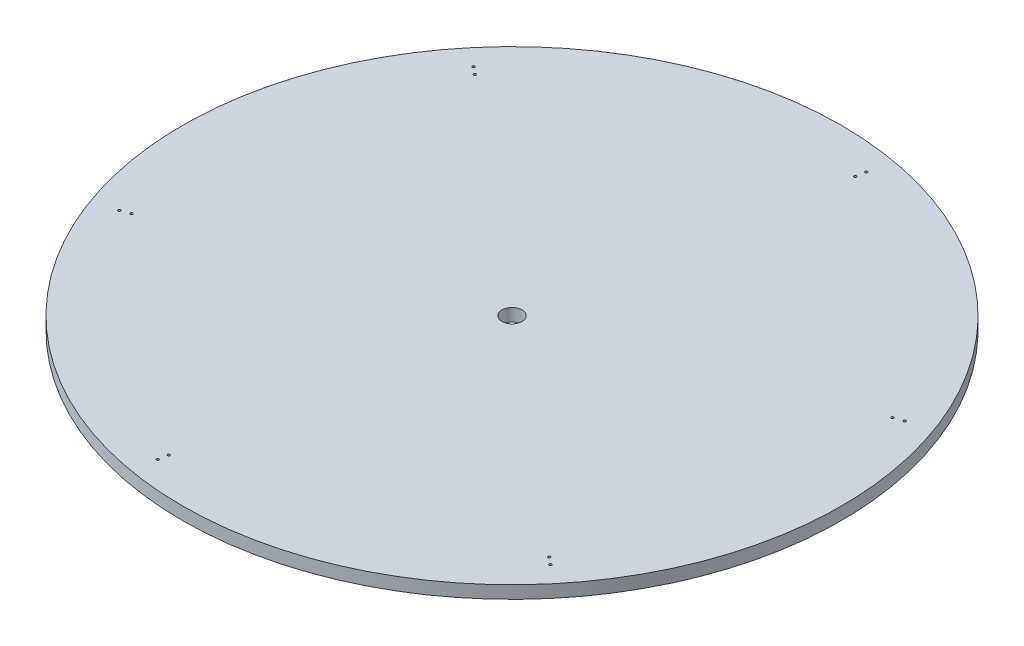
ISO-10303-21;
HEADER;
FILE_DESCRIPTION(('STEP AP214'),'2;1');
FILE_NAME('part.step','',(''),(''),'','','');
FILE_SCHEMA(('AUTOMOTIVE_DESIGN { 1 0 10303 214 1 1 1 1 }'));
ENDSEC;
DATA;
#1=APPLICATION_CONTEXT('core data for automotive mechanical design processes');
#2=APPLICATION_PROTOCOL_DEFINITION('international standard','automotive_design',2000,#1);
#3=PRODUCT_CONTEXT('',#1,'mechanical');
#4=PRODUCT('Part','Part','',(#3));
#5=PRODUCT_RELATED_PRODUCT_CATEGORY('part','',(#4));
#6=PRODUCT_DEFINITION_FORMATION('','',#4);
#7=PRODUCT_DEFINITION_CONTEXT('part definition',#1,'design');
#8=PRODUCT_DEFINITION('design','',#6,#7);
#9=PRODUCT_DEFINITION_SHAPE('','',#8);
#10=(LENGTH_UNIT() NAMED_UNIT(*) SI_UNIT(.MILLI.,.METRE.));
#11=(NAMED_UNIT(*) PLANE_ANGLE_UNIT() SI_UNIT($,.RADIAN.));
#12=(NAMED_UNIT(*) SI_UNIT($,.STERADIAN.) SOLID_ANGLE_UNIT());
#13=UNCERTAINTY_MEASURE_WITH_UNIT(LENGTH_MEASURE(1.E-05),#10,'distance_accuracy_value','');
#14=(GEOMETRIC_REPRESENTATION_CONTEXT(3) GLOBAL_UNCERTAINTY_ASSIGNED_CONTEXT((#13)) GLOBAL_UNIT_ASSIGNED_CONTEXT((#10,
#11,#12)) REPRESENTATION_CONTEXT('',''));
#15=CARTESIAN_POINT('',(0.,0.,0.));
#16=DIRECTION('',(0.,0.,1.));
#17=DIRECTION('',(1.,0.,0.));
#18=AXIS2_PLACEMENT_3D('',#15,#16,#17);
#19=CARTESIAN_POINT('',(0.,20.,0.));
#20=DIRECTION('',(0.,-1.,0.));
#21=DIRECTION('',(0.,0.,-1.));
#22=AXIS2_PLACEMENT_3D('',#19,#20,#21);
#23=CYLINDRICAL_SURFACE('',#22,520.);
#24=CARTESIAN_POINT('',(0.,20.,0.));
#25=DIRECTION('',(0.,1.,0.));
#26=DIRECTION('',(0.,0.,1.));
#27=AXIS2_PLACEMENT_3D('',#24,#25,#26);
#28=CIRCLE('',#27,520.);
#29=CARTESIAN_POINT('',(0.,20.,520.));
#30=VERTEX_POINT('',#29);
#31=EDGE_CURVE('E10',#30,#30,#28,.T.);
#32=ORIENTED_EDGE('',*,*,#31,.F.);
#33=EDGE_LOOP('',(#32));
#34=FACE_BOUND('',#33,.T.);
#35=CARTESIAN_POINT('',(0.,0.,0.));
#36=DIRECTION('',(0.,1.,0.));
#37=DIRECTION('',(0.,0.,1.));
#38=AXIS2_PLACEMENT_3D('',#35,#36,#37);
#39=CIRCLE('',#38,520.);
#40=CARTESIAN_POINT('',(0.,0.,520.));
#41=VERTEX_POINT('',#40);
#42=EDGE_CURVE('E38',#41,#41,#39,.T.);
#43=ORIENTED_EDGE('',*,*,#42,.T.);
#44=EDGE_LOOP('',(#43));
#45=FACE_BOUND('',#44,.T.);
#46=ADVANCED_FACE('F31',(#34,#45),#23,.T.);
#47=CARTESIAN_POINT('',(0.,20.,0.));
#48=DIRECTION('',(0.,1.,0.));
#49=DIRECTION('',(0.,0.,1.));
#50=AXIS2_PLACEMENT_3D('',#47,#48,#49);
#51=PLANE('',#50);
#52=CARTESIAN_POINT('',(-83.1513001658663,20.,475.788671620787));
#53=DIRECTION('',(0.,1.,0.));
#54=DIRECTION('',(0.,0.,1.));
#55=AXIS2_PLACEMENT_3D('',#52,#53,#54);
#56=CIRCLE('',#55,2.);
#57=CARTESIAN_POINT('',(-83.1513001658663,20.,477.788671620787));
#58=VERTEX_POINT('',#57);
#59=EDGE_CURVE('E93',#58,#58,#56,.F.);
#60=ORIENTED_EDGE('',*,*,#59,.T.);
#61=EDGE_LOOP('',(#60));
#62=FACE_BOUND('',#61,.T.);
#63=CARTESIAN_POINT('',(-80.5629493191627,20.,461.013677884939));
#64=DIRECTION('',(0.,1.,0.));
#65=DIRECTION('',(0.,0.,1.));
#66=AXIS2_PLACEMENT_3D('',#63,#64,#65);
#67=CIRCLE('',#66,2.00709120209909);
#68=CARTESIAN_POINT('',(-80.5629493191627,20.,463.020769087038));
#69=VERTEX_POINT('',#68);
#70=EDGE_CURVE('E90',#69,#69,#67,.F.);
#71=ORIENTED_EDGE('',*,*,#70,.T.);
#72=EDGE_LOOP('',(#71));
#73=FACE_BOUND('',#72,.T.);
#74=CARTESIAN_POINT('',(370.469426373522,20.,309.905474111738));
#75=DIRECTION('',(0.,1.,0.));
#76=DIRECTION('',(0.,0.,1.));
#77=AXIS2_PLACEMENT_3D('',#74,#75,#76);
#78=CIRCLE('',#77,2.);
#79=CARTESIAN_POINT('',(370.469426373522,20.,311.905474111738));
#80=VERTEX_POINT('',#79);
#81=EDGE_CURVE('E87',#80,#80,#78,.F.);
#82=ORIENTED_EDGE('',*,*,#81,.T.);
#83=EDGE_LOOP('',(#82));
#84=FACE_BOUND('',#83,.T.);
#85=CARTESIAN_POINT('',(358.968081880873,20.,300.276399656662));
#86=DIRECTION('',(0.,1.,0.));
#87=DIRECTION('',(0.,0.,1.));
#88=AXIS2_PLACEMENT_3D('',#85,#86,#87);
#89=CIRCLE('',#88,2.00709120209909);
#90=CARTESIAN_POINT('',(358.968081880873,20.,302.283490858761));
#91=VERTEX_POINT('',#90);
#92=EDGE_CURVE('E83',#91,#91,#89,.F.);
#93=ORIENTED_EDGE('',*,*,#92,.T.);
#94=EDGE_LOOP('',(#93));
#95=FACE_BOUND('',#94,.T.);
#96=CARTESIAN_POINT('',(453.620726539385,20.,-165.883197509054));
#97=DIRECTION('',(0.,1.,0.));
#98=DIRECTION('',(0.,0.,1.));
#99=AXIS2_PLACEMENT_3D('',#96,#97,#98);
#100=CIRCLE('',#99,2.);
#101=CARTESIAN_POINT('',(453.620726539385,20.,-163.883197509054));
#102=VERTEX_POINT('',#101);
#103=EDGE_CURVE('E79',#102,#102,#100,.F.);
#104=ORIENTED_EDGE('',*,*,#103,.T.);
#105=EDGE_LOOP('',(#104));
#106=FACE_BOUND('',#105,.T.);
#107=CARTESIAN_POINT('',(439.531031200033,20.,-160.737278228281));
#108=DIRECTION('',(0.,1.,0.));
#109=DIRECTION('',(0.,0.,1.));
#110=AXIS2_PLACEMENT_3D('',#107,#108,#109);
#111=CIRCLE('',#110,2.00709120209909);
#112=CARTESIAN_POINT('',(439.531031200033,20.,-158.730187026182));
#113=VERTEX_POINT('',#112);
#114=EDGE_CURVE('E75',#113,#113,#111,.F.);
#115=ORIENTED_EDGE('',*,*,#114,.T.);
#116=EDGE_LOOP('',(#115));
#117=FACE_BOUND('',#116,.T.);
#118=CARTESIAN_POINT('',(83.1513001658629,20.,-475.788671620788));
#119=DIRECTION('',(0.,1.,0.));
#120=DIRECTION('',(0.,0.,1.));
#121=AXIS2_PLACEMENT_3D('',#118,#119,#120);
#122=CIRCLE('',#121,2.);
#123=CARTESIAN_POINT('',(83.1513001658629,20.,-473.788671620788));
#124=VERTEX_POINT('',#123);
#125=EDGE_CURVE('E71',#124,#124,#122,.F.);
#126=ORIENTED_EDGE('',*,*,#125,.T.);
#127=EDGE_LOOP('',(#126));
#128=FACE_BOUND('',#127,.T.);
#129=CARTESIAN_POINT('',(80.5629493191595,20.,-461.013677884939));
#130=DIRECTION('',(0.,1.,0.));
#131=DIRECTION('',(0.,0.,1.));
#132=AXIS2_PLACEMENT_3D('',#129,#130,#131);
#133=CIRCLE('',#132,2.00709120209909);
#134=CARTESIAN_POINT('',(80.5629493191595,20.,-459.00658668284));
#135=VERTEX_POINT('',#134);
#136=EDGE_CURVE('E67',#135,#135,#133,.F.);
#137=ORIENTED_EDGE('',*,*,#136,.T.);
#138=EDGE_LOOP('',(#137));
#139=FACE_BOUND('',#138,.T.);
#140=CARTESIAN_POINT('',(-370.469426373524,20.,-309.905474111736));
#141=DIRECTION('',(0.,1.,0.));
#142=DIRECTION('',(0.,0.,1.));
#143=AXIS2_PLACEMENT_3D('',#140,#141,#142);
#144=CIRCLE('',#143,2.);
#145=CARTESIAN_POINT('',(-370.469426373524,20.,-307.905474111736));
#146=VERTEX_POINT('',#145);
#147=EDGE_CURVE('E63',#146,#146,#144,.F.);
#148=ORIENTED_EDGE('',*,*,#147,.T.);
#149=EDGE_LOOP('',(#148));
#150=FACE_BOUND('',#149,.T.);
#151=CARTESIAN_POINT('',(-358.968081880875,20.,-300.276399656659));
#152=DIRECTION('',(0.,1.,0.));
#153=DIRECTION('',(0.,0.,1.));
#154=AXIS2_PLACEMENT_3D('',#151,#152,#153);
#155=CIRCLE('',#154,2.00709120209909);
#156=CARTESIAN_POINT('',(-358.968081880875,20.,-298.26930845456));
#157=VERTEX_POINT('',#156);
#158=EDGE_CURVE('E59',#157,#157,#155,.F.);
#159=ORIENTED_EDGE('',*,*,#158,.T.);
#160=EDGE_LOOP('',(#159));
#161=FACE_BOUND('',#160,.T.);
#162=CARTESIAN_POINT('',(-453.620726539385,20.,165.883197509054));
#163=DIRECTION('',(0.,1.,0.));
#164=DIRECTION('',(0.,0.,1.));
#165=AXIS2_PLACEMENT_3D('',#162,#163,#164);
#166=CIRCLE('',#165,2.);
#167=CARTESIAN_POINT('',(-453.620726539385,20.,167.883197509054));
#168=VERTEX_POINT('',#167);
#169=EDGE_CURVE('E55',#168,#168,#166,.F.);
#170=ORIENTED_EDGE('',*,*,#169,.T.);
#171=EDGE_LOOP('',(#170));
#172=FACE_BOUND('',#171,.T.);
#173=CARTESIAN_POINT('',(-439.531031200033,20.,160.737278228281));
#174=DIRECTION('',(0.,1.,0.));
#175=DIRECTION('',(0.,0.,1.));
#176=AXIS2_PLACEMENT_3D('',#173,#174,#175);
#177=CIRCLE('',#176,2.00709120209909);
#178=CARTESIAN_POINT('',(-439.531031200033,20.,162.74436943038));
#179=VERTEX_POINT('',#178);
#180=EDGE_CURVE('E51',#179,#179,#177,.F.);
#181=ORIENTED_EDGE('',*,*,#180,.T.);
#182=EDGE_LOOP('',(#181));
#183=FACE_BOUND('',#182,.T.);
#184=CARTESIAN_POINT('',(0.,20.,0.));
#185=DIRECTION('',(0.,1.,0.));
#186=DIRECTION('',(0.,0.,1.));
#187=AXIS2_PLACEMENT_3D('',#184,#185,#186);
#188=CIRCLE('',#187,15.875);
#189=CARTESIAN_POINT('',(0.,20.,15.875));
#190=VERTEX_POINT('',#189);
#191=EDGE_CURVE('E43',#190,#190,#188,.F.);
#192=ORIENTED_EDGE('',*,*,#191,.T.);
#193=EDGE_LOOP('',(#192));
#194=FACE_BOUND('',#193,.T.);
#195=ORIENTED_EDGE('',*,*,#31,.T.);
#196=EDGE_LOOP('',(#195));
#197=FACE_BOUND('',#196,.T.);
#198=ADVANCED_FACE('F124',(#62,#73,#84,#95,#106,#117,#128,#139,#150,#161,#172,#183,#194,#197),
#51,.T.);
#199=CARTESIAN_POINT('',(0.,0.,0.));
#200=DIRECTION('',(0.,1.,0.));
#201=DIRECTION('',(0.,0.,1.));
#202=AXIS2_PLACEMENT_3D('',#199,#200,#201);
#203=PLANE('',#202);
#204=CARTESIAN_POINT('',(-83.1513001658663,0.,475.788671620787));
#205=DIRECTION('',(0.,1.,0.));
#206=DIRECTION('',(0.,0.,1.));
#207=AXIS2_PLACEMENT_3D('',#204,#205,#206);
#208=CIRCLE('',#207,2.);
#209=CARTESIAN_POINT('',(-83.1513001658663,0.,477.788671620787));
#210=VERTEX_POINT('',#209);
#211=EDGE_CURVE('E34',#210,#210,#208,.F.);
#212=ORIENTED_EDGE('',*,*,#211,.F.);
#213=EDGE_LOOP('',(#212));
#214=FACE_BOUND('',#213,.T.);
#215=CARTESIAN_POINT('',(-80.5629493191627,0.,461.013677884939));
#216=DIRECTION('',(0.,1.,0.));
#217=DIRECTION('',(0.,0.,1.));
#218=AXIS2_PLACEMENT_3D('',#215,#216,#217);
#219=CIRCLE('',#218,2.00709120209909);
#220=CARTESIAN_POINT('',(-80.5629493191627,0.,463.020769087038));
#221=VERTEX_POINT('',#220);
#222=EDGE_CURVE('E91',#221,#221,#219,.F.);
#223=ORIENTED_EDGE('',*,*,#222,.F.);
#224=EDGE_LOOP('',(#223));
#225=FACE_BOUND('',#224,.T.);
#226=CARTESIAN_POINT('',(370.469426373522,0.,309.905474111738));
#227=DIRECTION('',(0.,1.,0.));
#228=DIRECTION('',(0.,0.,1.));
#229=AXIS2_PLACEMENT_3D('',#226,#227,#228);
#230=CIRCLE('',#229,2.);
#231=CARTESIAN_POINT('',(370.469426373522,0.,311.905474111738));
#232=VERTEX_POINT('',#231);
#233=EDGE_CURVE('E88',#232,#232,#230,.F.);
#234=ORIENTED_EDGE('',*,*,#233,.F.);
#235=EDGE_LOOP('',(#234));
#236=FACE_BOUND('',#235,.T.);
#237=CARTESIAN_POINT('',(358.968081880873,0.,300.276399656662));
#238=DIRECTION('',(0.,1.,0.));
#239=DIRECTION('',(0.,0.,1.));
#240=AXIS2_PLACEMENT_3D('',#237,#238,#239);
#241=CIRCLE('',#240,2.00709120209909);
#242=CARTESIAN_POINT('',(358.968081880873,0.,302.283490858761));
#243=VERTEX_POINT('',#242);
#244=EDGE_CURVE('E84',#243,#243,#241,.F.);
#245=ORIENTED_EDGE('',*,*,#244,.F.);
#246=EDGE_LOOP('',(#245));
#247=FACE_BOUND('',#246,.T.);
#248=CARTESIAN_POINT('',(453.620726539385,0.,-165.883197509054));
#249=DIRECTION('',(0.,1.,0.));
#250=DIRECTION('',(0.,0.,1.));
#251=AXIS2_PLACEMENT_3D('',#248,#249,#250);
#252=CIRCLE('',#251,2.);
#253=CARTESIAN_POINT('',(453.620726539385,0.,-163.883197509054));
#254=VERTEX_POINT('',#253);
#255=EDGE_CURVE('E80',#254,#254,#252,.F.);
#256=ORIENTED_EDGE('',*,*,#255,.F.);
#257=EDGE_LOOP('',(#256));
#258=FACE_BOUND('',#257,.T.);
#259=CARTESIAN_POINT('',(439.531031200033,0.,-160.737278228281));
#260=DIRECTION('',(0.,1.,0.));
#261=DIRECTION('',(0.,0.,1.));
#262=AXIS2_PLACEMENT_3D('',#259,#260,#261);
#263=CIRCLE('',#262,2.00709120209909);
#264=CARTESIAN_POINT('',(439.531031200033,0.,-158.730187026182));
#265=VERTEX_POINT('',#264);
#266=EDGE_CURVE('E76',#265,#265,#263,.F.);
#267=ORIENTED_EDGE('',*,*,#266,.F.);
#268=EDGE_LOOP('',(#267));
#269=FACE_BOUND('',#268,.T.);
#270=CARTESIAN_POINT('',(83.1513001658629,0.,-475.788671620788));
#271=DIRECTION('',(0.,1.,0.));
#272=DIRECTION('',(0.,0.,1.));
#273=AXIS2_PLACEMENT_3D('',#270,#271,#272);
#274=CIRCLE('',#273,2.);
#275=CARTESIAN_POINT('',(83.1513001658629,0.,-473.788671620788));
#276=VERTEX_POINT('',#275);
#277=EDGE_CURVE('E72',#276,#276,#274,.F.);
#278=ORIENTED_EDGE('',*,*,#277,.F.);
#279=EDGE_LOOP('',(#278));
#280=FACE_BOUND('',#279,.T.);
#281=CARTESIAN_POINT('',(80.5629493191595,0.,-461.013677884939));
#282=DIRECTION('',(0.,1.,0.));
#283=DIRECTION('',(0.,0.,1.));
#284=AXIS2_PLACEMENT_3D('',#281,#282,#283);
#285=CIRCLE('',#284,2.00709120209909);
#286=CARTESIAN_POINT('',(80.5629493191595,0.,-459.00658668284));
#287=VERTEX_POINT('',#286);
#288=EDGE_CURVE('E68',#287,#287,#285,.F.);
#289=ORIENTED_EDGE('',*,*,#288,.F.);
#290=EDGE_LOOP('',(#289));
#291=FACE_BOUND('',#290,.T.);
#292=CARTESIAN_POINT('',(-370.469426373524,0.,-309.905474111736));
#293=DIRECTION('',(0.,1.,0.));
#294=DIRECTION('',(0.,0.,1.));
#295=AXIS2_PLACEMENT_3D('',#292,#293,#294);
#296=CIRCLE('',#295,2.);
#297=CARTESIAN_POINT('',(-370.469426373524,0.,-307.905474111736));
#298=VERTEX_POINT('',#297);
#299=EDGE_CURVE('E64',#298,#298,#296,.F.);
#300=ORIENTED_EDGE('',*,*,#299,.F.);
#301=EDGE_LOOP('',(#300));
#302=FACE_BOUND('',#301,.T.);
#303=CARTESIAN_POINT('',(-358.968081880875,0.,-300.276399656659));
#304=DIRECTION('',(0.,1.,0.));
#305=DIRECTION('',(0.,0.,1.));
#306=AXIS2_PLACEMENT_3D('',#303,#304,#305);
#307=CIRCLE('',#306,2.00709120209909);
#308=CARTESIAN_POINT('',(-358.968081880875,0.,-298.26930845456));
#309=VERTEX_POINT('',#308);
#310=EDGE_CURVE('E60',#309,#309,#307,.F.);
#311=ORIENTED_EDGE('',*,*,#310,.F.);
#312=EDGE_LOOP('',(#311));
#313=FACE_BOUND('',#312,.T.);
#314=CARTESIAN_POINT('',(-453.620726539385,0.,165.883197509054));
#315=DIRECTION('',(0.,1.,0.));
#316=DIRECTION('',(0.,0.,1.));
#317=AXIS2_PLACEMENT_3D('',#314,#315,#316);
#318=CIRCLE('',#317,2.);
#319=CARTESIAN_POINT('',(-453.620726539385,0.,167.883197509054));
#320=VERTEX_POINT('',#319);
#321=EDGE_CURVE('E56',#320,#320,#318,.F.);
#322=ORIENTED_EDGE('',*,*,#321,.F.);
#323=EDGE_LOOP('',(#322));
#324=FACE_BOUND('',#323,.T.);
#325=CARTESIAN_POINT('',(-439.531031200033,0.,160.737278228281));
#326=DIRECTION('',(0.,1.,0.));
#327=DIRECTION('',(0.,0.,1.));
#328=AXIS2_PLACEMENT_3D('',#325,#326,#327);
#329=CIRCLE('',#328,2.00709120209909);
#330=CARTESIAN_POINT('',(-439.531031200033,0.,162.74436943038));
#331=VERTEX_POINT('',#330);
#332=EDGE_CURVE('E52',#331,#331,#329,.F.);
#333=ORIENTED_EDGE('',*,*,#332,.F.);
#334=EDGE_LOOP('',(#333));
#335=FACE_BOUND('',#334,.T.);
#336=CARTESIAN_POINT('',(0.,0.,0.));
#337=DIRECTION('',(0.,1.,0.));
#338=DIRECTION('',(0.,0.,1.));
#339=AXIS2_PLACEMENT_3D('',#336,#337,#338);
#340=CIRCLE('',#339,15.875);
#341=CARTESIAN_POINT('',(0.,0.,15.875));
#342=VERTEX_POINT('',#341);
#343=EDGE_CURVE('E48',#342,#342,#340,.F.);
#344=ORIENTED_EDGE('',*,*,#343,.F.);
#345=EDGE_LOOP('',(#344));
#346=FACE_BOUND('',#345,.T.);
#347=ORIENTED_EDGE('',*,*,#42,.F.);
#348=EDGE_LOOP('',(#347));
#349=FACE_BOUND('',#348,.T.);
#350=ADVANCED_FACE('F135',(#214,#225,#236,#247,#258,#269,#280,#291,#302,#313,#324,#335,#346,
#349),#203,.F.);
#351=CARTESIAN_POINT('',(0.,91.,0.));
#352=DIRECTION('',(0.,-1.,0.));
#353=DIRECTION('',(0.,0.,-1.));
#354=AXIS2_PLACEMENT_3D('',#351,#352,#353);
#355=CYLINDRICAL_SURFACE('',#354,15.875);
#356=ORIENTED_EDGE('',*,*,#191,.F.);
#357=EDGE_LOOP('',(#356));
#358=FACE_BOUND('',#357,.T.);
#359=ORIENTED_EDGE('',*,*,#343,.T.);
#360=EDGE_LOOP('',(#359));
#361=FACE_BOUND('',#360,.T.);
#362=ADVANCED_FACE('F131',(#358,#361),#355,.F.);
#363=CARTESIAN_POINT('',(-439.531031200033,91.,160.737278228281));
#364=DIRECTION('',(0.,-1.,0.));
#365=DIRECTION('',(0.,0.,-1.));
#366=AXIS2_PLACEMENT_3D('',#363,#364,#365);
#367=CYLINDRICAL_SURFACE('',#366,2.00709120209909);
#368=ORIENTED_EDGE('',*,*,#180,.F.);
#369=EDGE_LOOP('',(#368));
#370=FACE_BOUND('',#369,.T.);
#371=ORIENTED_EDGE('',*,*,#332,.T.);
#372=EDGE_LOOP('',(#371));
#373=FACE_BOUND('',#372,.T.);
#374=ADVANCED_FACE('F127',(#370,#373),#367,.F.);
#375=CARTESIAN_POINT('',(-453.620726539385,91.,165.883197509054));
#376=DIRECTION('',(0.,-1.,0.));
#377=DIRECTION('',(0.,0.,-1.));
#378=AXIS2_PLACEMENT_3D('',#375,#376,#377);
#379=CYLINDRICAL_SURFACE('',#378,2.);
#380=ORIENTED_EDGE('',*,*,#169,.F.);
#381=EDGE_LOOP('',(#380));
#382=FACE_BOUND('',#381,.T.);
#383=ORIENTED_EDGE('',*,*,#321,.T.);
#384=EDGE_LOOP('',(#383));
#385=FACE_BOUND('',#384,.T.);
#386=ADVANCED_FACE('F130',(#382,#385),#379,.F.);
#387=CARTESIAN_POINT('',(-358.968081880875,91.,-300.276399656659));
#388=DIRECTION('',(0.,-1.,0.));
#389=DIRECTION('',(0.,0.,-1.));
#390=AXIS2_PLACEMENT_3D('',#387,#388,#389);
#391=CYLINDRICAL_SURFACE('',#390,2.00709120209909);
#392=ORIENTED_EDGE('',*,*,#158,.F.);
#393=EDGE_LOOP('',(#392));
#394=FACE_BOUND('',#393,.T.);
#395=ORIENTED_EDGE('',*,*,#310,.T.);
#396=EDGE_LOOP('',(#395));
#397=FACE_BOUND('',#396,.T.);
#398=ADVANCED_FACE('F158',(#394,#397),#391,.F.);
#399=CARTESIAN_POINT('',(-370.469426373524,91.,-309.905474111736));
#400=DIRECTION('',(0.,-1.,0.));
#401=DIRECTION('',(0.,0.,-1.));
#402=AXIS2_PLACEMENT_3D('',#399,#400,#401);
#403=CYLINDRICAL_SURFACE('',#402,2.);
#404=ORIENTED_EDGE('',*,*,#147,.F.);
#405=EDGE_LOOP('',(#404));
#406=FACE_BOUND('',#405,.T.);
#407=ORIENTED_EDGE('',*,*,#299,.T.);
#408=EDGE_LOOP('',(#407));
#409=FACE_BOUND('',#408,.T.);
#410=ADVANCED_FACE('F162',(#406,#409),#403,.F.);
#411=CARTESIAN_POINT('',(80.5629493191595,91.,-461.013677884939));
#412=DIRECTION('',(0.,-1.,0.));
#413=DIRECTION('',(0.,0.,-1.));
#414=AXIS2_PLACEMENT_3D('',#411,#412,#413);
#415=CYLINDRICAL_SURFACE('',#414,2.00709120209909);
#416=ORIENTED_EDGE('',*,*,#136,.F.);
#417=EDGE_LOOP('',(#416));
#418=FACE_BOUND('',#417,.T.);
#419=ORIENTED_EDGE('',*,*,#288,.T.);
#420=EDGE_LOOP('',(#419));
#421=FACE_BOUND('',#420,.T.);
#422=ADVANCED_FACE('F166',(#418,#421),#415,.F.);
#423=CARTESIAN_POINT('',(83.1513001658629,91.,-475.788671620788));
#424=DIRECTION('',(0.,-1.,0.));
#425=DIRECTION('',(0.,0.,-1.));
#426=AXIS2_PLACEMENT_3D('',#423,#424,#425);
#427=CYLINDRICAL_SURFACE('',#426,2.);
#428=ORIENTED_EDGE('',*,*,#125,.F.);
#429=EDGE_LOOP('',(#428));
#430=FACE_BOUND('',#429,.T.);
#431=ORIENTED_EDGE('',*,*,#277,.T.);
#432=EDGE_LOOP('',(#431));
#433=FACE_BOUND('',#432,.T.);
#434=ADVANCED_FACE('F170',(#430,#433),#427,.F.);
#435=CARTESIAN_POINT('',(439.531031200033,91.,-160.737278228281));
#436=DIRECTION('',(0.,-1.,0.));
#437=DIRECTION('',(0.,0.,-1.));
#438=AXIS2_PLACEMENT_3D('',#435,#436,#437);
#439=CYLINDRICAL_SURFACE('',#438,2.00709120209909);
#440=ORIENTED_EDGE('',*,*,#114,.F.);
#441=EDGE_LOOP('',(#440));
#442=FACE_BOUND('',#441,.T.);
#443=ORIENTED_EDGE('',*,*,#266,.T.);
#444=EDGE_LOOP('',(#443));
#445=FACE_BOUND('',#444,.T.);
#446=ADVANCED_FACE('F174',(#442,#445),#439,.F.);
#447=CARTESIAN_POINT('',(453.620726539385,91.,-165.883197509054));
#448=DIRECTION('',(0.,-1.,0.));
#449=DIRECTION('',(0.,0.,-1.));
#450=AXIS2_PLACEMENT_3D('',#447,#448,#449);
#451=CYLINDRICAL_SURFACE('',#450,2.);
#452=ORIENTED_EDGE('',*,*,#103,.F.);
#453=EDGE_LOOP('',(#452));
#454=FACE_BOUND('',#453,.T.);
#455=ORIENTED_EDGE('',*,*,#255,.T.);
#456=EDGE_LOOP('',(#455));
#457=FACE_BOUND('',#456,.T.);
#458=ADVANCED_FACE('F178',(#454,#457),#451,.F.);
#459=CARTESIAN_POINT('',(358.968081880873,91.,300.276399656662));
#460=DIRECTION('',(0.,-1.,0.));
#461=DIRECTION('',(0.,0.,-1.));
#462=AXIS2_PLACEMENT_3D('',#459,#460,#461);
#463=CYLINDRICAL_SURFACE('',#462,2.00709120209909);
#464=ORIENTED_EDGE('',*,*,#92,.F.);
#465=EDGE_LOOP('',(#464));
#466=FACE_BOUND('',#465,.T.);
#467=ORIENTED_EDGE('',*,*,#244,.T.);
#468=EDGE_LOOP('',(#467));
#469=FACE_BOUND('',#468,.T.);
#470=ADVANCED_FACE('F182',(#466,#469),#463,.F.);
#471=CARTESIAN_POINT('',(370.469426373522,91.,309.905474111738));
#472=DIRECTION('',(0.,-1.,0.));
#473=DIRECTION('',(0.,0.,-1.));
#474=AXIS2_PLACEMENT_3D('',#471,#472,#473);
#475=CYLINDRICAL_SURFACE('',#474,2.);
#476=ORIENTED_EDGE('',*,*,#81,.F.);
#477=EDGE_LOOP('',(#476));
#478=FACE_BOUND('',#477,.T.);
#479=ORIENTED_EDGE('',*,*,#233,.T.);
#480=EDGE_LOOP('',(#479));
#481=FACE_BOUND('',#480,.T.);
#482=ADVANCED_FACE('F186',(#478,#481),#475,.F.);
#483=CARTESIAN_POINT('',(-80.5629493191627,91.,461.013677884939));
#484=DIRECTION('',(0.,-1.,0.));
#485=DIRECTION('',(0.,0.,-1.));
#486=AXIS2_PLACEMENT_3D('',#483,#484,#485);
#487=CYLINDRICAL_SURFACE('',#486,2.00709120209909);
#488=ORIENTED_EDGE('',*,*,#70,.F.);
#489=EDGE_LOOP('',(#488));
#490=FACE_BOUND('',#489,.T.);
#491=ORIENTED_EDGE('',*,*,#222,.T.);
#492=EDGE_LOOP('',(#491));
#493=FACE_BOUND('',#492,.T.);
#494=ADVANCED_FACE('F190',(#490,#493),#487,.F.);
#495=CARTESIAN_POINT('',(-83.1513001658663,91.,475.788671620787));
#496=DIRECTION('',(0.,-1.,0.));
#497=DIRECTION('',(0.,0.,-1.));
#498=AXIS2_PLACEMENT_3D('',#495,#496,#497);
#499=CYLINDRICAL_SURFACE('',#498,2.);
#500=ORIENTED_EDGE('',*,*,#59,.F.);
#501=EDGE_LOOP('',(#500));
#502=FACE_BOUND('',#501,.T.);
#503=ORIENTED_EDGE('',*,*,#211,.T.);
#504=EDGE_LOOP('',(#503));
#505=FACE_BOUND('',#504,.T.);
#506=ADVANCED_FACE('F194',(#502,#505),#499,.F.);
#507=CLOSED_SHELL('',(#46,#198,#350,#362,#374,#386,#398,#410,#422,#434,#446,#458,#470,#482,#494,#506));
#508=MANIFOLD_SOLID_BREP('B2',#507);
#509=ADVANCED_BREP_SHAPE_REPRESENTATION('',(#18,#508),#14);
#510=SHAPE_DEFINITION_REPRESENTATION(#9,#509);
ENDSEC;
END-ISO-10303-21;
